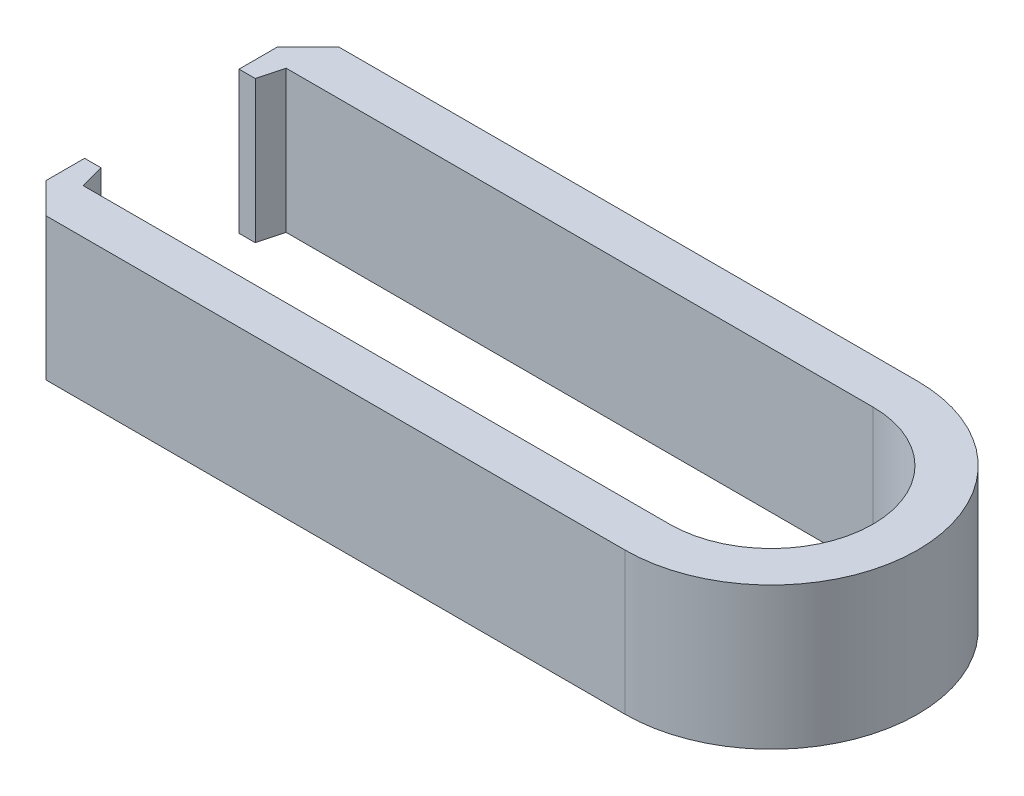
ISO-10303-21;
HEADER;
FILE_DESCRIPTION(('STEP AP214'),'2;1');
FILE_NAME('part.step','',(''),(''),'','','');
FILE_SCHEMA(('AUTOMOTIVE_DESIGN { 1 0 10303 214 1 1 1 1 }'));
ENDSEC;
DATA;
#1=APPLICATION_CONTEXT('core data for automotive mechanical design processes');
#2=APPLICATION_PROTOCOL_DEFINITION('international standard','automotive_design',2000,#1);
#3=PRODUCT_CONTEXT('',#1,'mechanical');
#4=PRODUCT('Part','Part','',(#3));
#5=PRODUCT_RELATED_PRODUCT_CATEGORY('part','',(#4));
#6=PRODUCT_DEFINITION_FORMATION('','',#4);
#7=PRODUCT_DEFINITION_CONTEXT('part definition',#1,'design');
#8=PRODUCT_DEFINITION('design','',#6,#7);
#9=PRODUCT_DEFINITION_SHAPE('','',#8);
#10=(LENGTH_UNIT() NAMED_UNIT(*) SI_UNIT(.MILLI.,.METRE.));
#11=(NAMED_UNIT(*) PLANE_ANGLE_UNIT() SI_UNIT($,.RADIAN.));
#12=(NAMED_UNIT(*) SI_UNIT($,.STERADIAN.) SOLID_ANGLE_UNIT());
#13=UNCERTAINTY_MEASURE_WITH_UNIT(LENGTH_MEASURE(1.E-05),#10,'distance_accuracy_value','');
#14=(GEOMETRIC_REPRESENTATION_CONTEXT(3) GLOBAL_UNCERTAINTY_ASSIGNED_CONTEXT((#13)) GLOBAL_UNIT_ASSIGNED_CONTEXT((#10,
#11,#12)) REPRESENTATION_CONTEXT('',''));
#15=CARTESIAN_POINT('',(0.,0.,0.));
#16=DIRECTION('',(0.,0.,1.));
#17=DIRECTION('',(1.,0.,0.));
#18=AXIS2_PLACEMENT_3D('',#15,#16,#17);
#19=CARTESIAN_POINT('',(-30.,7.,0.));
#20=DIRECTION('',(-1.,0.,0.));
#21=DIRECTION('',(0.,0.,1.));
#22=AXIS2_PLACEMENT_3D('',#19,#20,#21);
#23=PLANE('',#22);
#24=DIRECTION('',(0.,0.,-1.));
#25=VECTOR('',#24,1.);
#26=CARTESIAN_POINT('',(-30.,0.,0.));
#27=LINE('',#26,#25);
#28=CARTESIAN_POINT('',(-30.,0.,5.69999999999999));
#29=VERTEX_POINT('',#28);
#30=CARTESIAN_POINT('',(-30.,0.,3.8));
#31=VERTEX_POINT('',#30);
#32=EDGE_CURVE('E191',#29,#31,#27,.T.);
#33=ORIENTED_EDGE('',*,*,#32,.F.);
#34=DIRECTION('',(0.,1.,0.));
#35=VECTOR('',#34,1.);
#36=CARTESIAN_POINT('',(-30.,7.,5.69999999999999));
#37=LINE('',#36,#35);
#38=CARTESIAN_POINT('',(-30.,7.,5.69999999999999));
#39=VERTEX_POINT('',#38);
#40=EDGE_CURVE('E244',#29,#39,#37,.T.);
#41=ORIENTED_EDGE('',*,*,#40,.T.);
#42=DIRECTION('',(0.,0.,-1.));
#43=VECTOR('',#42,1.);
#44=CARTESIAN_POINT('',(-30.,7.,0.));
#45=LINE('',#44,#43);
#46=CARTESIAN_POINT('',(-30.,7.,3.8));
#47=VERTEX_POINT('',#46);
#48=EDGE_CURVE('E150',#39,#47,#45,.T.);
#49=ORIENTED_EDGE('',*,*,#48,.T.);
#50=DIRECTION('',(0.,-1.,0.));
#51=VECTOR('',#50,1.);
#52=CARTESIAN_POINT('',(-30.,7.,3.8));
#53=LINE('',#52,#51);
#54=EDGE_CURVE('E190',#47,#31,#53,.T.);
#55=ORIENTED_EDGE('',*,*,#54,.T.);
#56=EDGE_LOOP('',(#33,#41,#49,#55));
#57=FACE_BOUND('',#56,.T.);
#58=ADVANCED_FACE('F37',(#57),#23,.T.);
#59=CARTESIAN_POINT('',(0.,7.,7.2));
#60=DIRECTION('',(0.,0.,-1.));
#61=DIRECTION('',(-1.,0.,0.));
#62=AXIS2_PLACEMENT_3D('',#59,#60,#61);
#63=PLANE('',#62);
#64=DIRECTION('',(1.,0.,0.));
#65=VECTOR('',#64,1.);
#66=CARTESIAN_POINT('',(0.,7.,7.2));
#67=LINE('',#66,#65);
#68=CARTESIAN_POINT('',(-28.5,7.,7.2));
#69=VERTEX_POINT('',#68);
#70=CARTESIAN_POINT('',(0.,7.,7.2));
#71=VERTEX_POINT('',#70);
#72=EDGE_CURVE('E138',#69,#71,#67,.T.);
#73=ORIENTED_EDGE('',*,*,#72,.F.);
#74=DIRECTION('',(0.,-1.,0.));
#75=VECTOR('',#74,1.);
#76=CARTESIAN_POINT('',(-28.5,0.,7.2));
#77=LINE('',#76,#75);
#78=CARTESIAN_POINT('',(-28.5,0.,7.2));
#79=VERTEX_POINT('',#78);
#80=EDGE_CURVE('E160',#69,#79,#77,.T.);
#81=ORIENTED_EDGE('',*,*,#80,.T.);
#82=DIRECTION('',(1.,0.,0.));
#83=VECTOR('',#82,1.);
#84=CARTESIAN_POINT('',(0.,0.,7.2));
#85=LINE('',#84,#83);
#86=CARTESIAN_POINT('',(0.,0.,7.2));
#87=VERTEX_POINT('',#86);
#88=EDGE_CURVE('E156',#79,#87,#85,.T.);
#89=ORIENTED_EDGE('',*,*,#88,.T.);
#90=DIRECTION('',(0.,-1.,0.));
#91=VECTOR('',#90,1.);
#92=CARTESIAN_POINT('',(0.,7.,7.2));
#93=LINE('',#92,#91);
#94=EDGE_CURVE('E153',#71,#87,#93,.T.);
#95=ORIENTED_EDGE('',*,*,#94,.F.);
#96=EDGE_LOOP('',(#73,#81,#89,#95));
#97=FACE_BOUND('',#96,.T.);
#98=ADVANCED_FACE('F154',(#97),#63,.F.);
#99=CARTESIAN_POINT('',(0.,7.,0.));
#100=DIRECTION('',(0.,-1.,0.));
#101=DIRECTION('',(0.,0.,-1.));
#102=AXIS2_PLACEMENT_3D('',#99,#100,#101);
#103=CYLINDRICAL_SURFACE('',#102,7.2);
#104=CARTESIAN_POINT('',(0.,0.,0.));
#105=DIRECTION('',(0.,1.,0.));
#106=DIRECTION('',(0.,0.,1.));
#107=AXIS2_PLACEMENT_3D('',#104,#105,#106);
#108=CIRCLE('',#107,7.2);
#109=CARTESIAN_POINT('',(0.,0.,-7.2));
#110=VERTEX_POINT('',#109);
#111=EDGE_CURVE('E194',#87,#110,#108,.T.);
#112=ORIENTED_EDGE('',*,*,#111,.T.);
#113=DIRECTION('',(0.,-1.,0.));
#114=VECTOR('',#113,1.);
#115=CARTESIAN_POINT('',(0.,7.,-7.2));
#116=LINE('',#115,#114);
#117=CARTESIAN_POINT('',(0.,7.,-7.2));
#118=VERTEX_POINT('',#117);
#119=EDGE_CURVE('E161',#118,#110,#116,.T.);
#120=ORIENTED_EDGE('',*,*,#119,.F.);
#121=CARTESIAN_POINT('',(0.,7.,0.));
#122=DIRECTION('',(0.,1.,0.));
#123=DIRECTION('',(0.,0.,1.));
#124=AXIS2_PLACEMENT_3D('',#121,#122,#123);
#125=CIRCLE('',#124,7.2);
#126=EDGE_CURVE('E143',#71,#118,#125,.T.);
#127=ORIENTED_EDGE('',*,*,#126,.F.);
#128=ORIENTED_EDGE('',*,*,#94,.T.);
#129=EDGE_LOOP('',(#112,#120,#127,#128));
#130=FACE_BOUND('',#129,.T.);
#131=ADVANCED_FACE('F163',(#130),#103,.T.);
#132=CARTESIAN_POINT('',(0.,7.,-7.2));
#133=DIRECTION('',(0.,0.,-1.));
#134=DIRECTION('',(-1.,0.,0.));
#135=AXIS2_PLACEMENT_3D('',#132,#133,#134);
#136=PLANE('',#135);
#137=DIRECTION('',(1.,0.,0.));
#138=VECTOR('',#137,1.);
#139=CARTESIAN_POINT('',(0.,0.,-7.2));
#140=LINE('',#139,#138);
#141=CARTESIAN_POINT('',(-28.5,0.,-7.2));
#142=VERTEX_POINT('',#141);
#143=EDGE_CURVE('E196',#142,#110,#140,.T.);
#144=ORIENTED_EDGE('',*,*,#143,.F.);
#145=DIRECTION('',(0.,1.,0.));
#146=VECTOR('',#145,1.);
#147=CARTESIAN_POINT('',(-28.5,7.,-7.2));
#148=LINE('',#147,#146);
#149=CARTESIAN_POINT('',(-28.5,7.,-7.2));
#150=VERTEX_POINT('',#149);
#151=EDGE_CURVE('E11',#142,#150,#148,.T.);
#152=ORIENTED_EDGE('',*,*,#151,.T.);
#153=DIRECTION('',(1.,0.,0.));
#154=VECTOR('',#153,1.);
#155=CARTESIAN_POINT('',(0.,7.,-7.2));
#156=LINE('',#155,#154);
#157=EDGE_CURVE('E165',#150,#118,#156,.T.);
#158=ORIENTED_EDGE('',*,*,#157,.T.);
#159=ORIENTED_EDGE('',*,*,#119,.T.);
#160=EDGE_LOOP('',(#144,#152,#158,#159));
#161=FACE_BOUND('',#160,.T.);
#162=ADVANCED_FACE('F290',(#161),#136,.T.);
#163=CARTESIAN_POINT('',(-30.,7.,0.));
#164=DIRECTION('',(-1.,0.,0.));
#165=DIRECTION('',(0.,0.,1.));
#166=AXIS2_PLACEMENT_3D('',#163,#164,#165);
#167=PLANE('',#166);
#168=DIRECTION('',(0.,0.,-1.));
#169=VECTOR('',#168,1.);
#170=CARTESIAN_POINT('',(-30.,7.,0.));
#171=LINE('',#170,#169);
#172=CARTESIAN_POINT('',(-30.,7.,-3.8));
#173=VERTEX_POINT('',#172);
#174=CARTESIAN_POINT('',(-30.,7.,-5.7));
#175=VERTEX_POINT('',#174);
#176=EDGE_CURVE('E167',#173,#175,#171,.T.);
#177=ORIENTED_EDGE('',*,*,#176,.T.);
#178=DIRECTION('',(0.,-1.,0.));
#179=VECTOR('',#178,1.);
#180=CARTESIAN_POINT('',(-30.,7.,-5.7));
#181=LINE('',#180,#179);
#182=CARTESIAN_POINT('',(-30.,0.,-5.7));
#183=VERTEX_POINT('',#182);
#184=EDGE_CURVE('E46',#175,#183,#181,.T.);
#185=ORIENTED_EDGE('',*,*,#184,.T.);
#186=DIRECTION('',(0.,0.,-1.));
#187=VECTOR('',#186,1.);
#188=CARTESIAN_POINT('',(-30.,0.,0.));
#189=LINE('',#188,#187);
#190=CARTESIAN_POINT('',(-30.,0.,-3.8));
#191=VERTEX_POINT('',#190);
#192=EDGE_CURVE('E198',#191,#183,#189,.T.);
#193=ORIENTED_EDGE('',*,*,#192,.F.);
#194=DIRECTION('',(0.,-1.,0.));
#195=VECTOR('',#194,1.);
#196=CARTESIAN_POINT('',(-30.,7.,-3.8));
#197=LINE('',#196,#195);
#198=EDGE_CURVE('E236',#173,#191,#197,.T.);
#199=ORIENTED_EDGE('',*,*,#198,.F.);
#200=EDGE_LOOP('',(#177,#185,#193,#199));
#201=FACE_BOUND('',#200,.T.);
#202=ADVANCED_FACE('F251',(#201),#167,.T.);
#203=CARTESIAN_POINT('',(0.,7.,-3.8));
#204=DIRECTION('',(0.,0.,-1.));
#205=DIRECTION('',(-1.,0.,0.));
#206=AXIS2_PLACEMENT_3D('',#203,#204,#205);
#207=PLANE('',#206);
#208=DIRECTION('',(1.,0.,0.));
#209=VECTOR('',#208,1.);
#210=CARTESIAN_POINT('',(0.,0.,-3.8));
#211=LINE('',#210,#209);
#212=CARTESIAN_POINT('',(-29.2,0.,-3.8));
#213=VERTEX_POINT('',#212);
#214=EDGE_CURVE('E201',#191,#213,#211,.T.);
#215=ORIENTED_EDGE('',*,*,#214,.T.);
#216=DIRECTION('',(0.,-1.,0.));
#217=VECTOR('',#216,1.);
#218=CARTESIAN_POINT('',(-29.2,7.,-3.8));
#219=LINE('',#218,#217);
#220=CARTESIAN_POINT('',(-29.2,7.,-3.8));
#221=VERTEX_POINT('',#220);
#222=EDGE_CURVE('E233',#221,#213,#219,.T.);
#223=ORIENTED_EDGE('',*,*,#222,.F.);
#224=DIRECTION('',(1.,0.,0.));
#225=VECTOR('',#224,1.);
#226=CARTESIAN_POINT('',(0.,7.,-3.8));
#227=LINE('',#226,#225);
#228=EDGE_CURVE('E172',#173,#221,#227,.T.);
#229=ORIENTED_EDGE('',*,*,#228,.F.);
#230=ORIENTED_EDGE('',*,*,#198,.T.);
#231=EDGE_LOOP('',(#215,#223,#229,#230));
#232=FACE_BOUND('',#231,.T.);
#233=ADVANCED_FACE('F259',(#232),#207,.F.);
#234=CARTESIAN_POINT('',(-28.1939708952528,7.,-7.5545517328095));
#235=DIRECTION('',(-0.965925826289069,0.,-0.258819045102519));
#236=DIRECTION('',(-0.258819045102519,0.,0.965925826289069));
#237=AXIS2_PLACEMENT_3D('',#234,#235,#236);
#238=PLANE('',#237);
#239=DIRECTION('',(0.258819045102519,0.,-0.965925826289069));
#240=VECTOR('',#239,1.);
#241=CARTESIAN_POINT('',(-28.1939708952528,0.,-7.5545517328095));
#242=LINE('',#241,#240);
#243=CARTESIAN_POINT('',(-28.8784609690827,0.,-5.));
#244=VERTEX_POINT('',#243);
#245=EDGE_CURVE('E203',#213,#244,#242,.T.);
#246=ORIENTED_EDGE('',*,*,#245,.T.);
#247=DIRECTION('',(0.,-1.,0.));
#248=VECTOR('',#247,1.);
#249=CARTESIAN_POINT('',(-28.8784609690827,7.,-5.));
#250=LINE('',#249,#248);
#251=CARTESIAN_POINT('',(-28.8784609690827,7.,-5.));
#252=VERTEX_POINT('',#251);
#253=EDGE_CURVE('E231',#252,#244,#250,.T.);
#254=ORIENTED_EDGE('',*,*,#253,.F.);
#255=DIRECTION('',(0.258819045102519,0.,-0.965925826289069));
#256=VECTOR('',#255,1.);
#257=CARTESIAN_POINT('',(-28.1939708952528,7.,-7.5545517328095));
#258=LINE('',#257,#256);
#259=EDGE_CURVE('E174',#221,#252,#258,.T.);
#260=ORIENTED_EDGE('',*,*,#259,.F.);
#261=ORIENTED_EDGE('',*,*,#222,.T.);
#262=EDGE_LOOP('',(#246,#254,#260,#261));
#263=FACE_BOUND('',#262,.T.);
#264=ADVANCED_FACE('F263',(#263),#238,.F.);
#265=CARTESIAN_POINT('',(0.,7.,-5.));
#266=DIRECTION('',(0.,0.,1.));
#267=DIRECTION('',(1.,0.,0.));
#268=AXIS2_PLACEMENT_3D('',#265,#266,#267);
#269=PLANE('',#268);
#270=DIRECTION('',(-1.,0.,0.));
#271=VECTOR('',#270,1.);
#272=CARTESIAN_POINT('',(0.,0.,-5.));
#273=LINE('',#272,#271);
#274=CARTESIAN_POINT('',(0.,0.,-5.));
#275=VERTEX_POINT('',#274);
#276=EDGE_CURVE('E206',#275,#244,#273,.T.);
#277=ORIENTED_EDGE('',*,*,#276,.F.);
#278=DIRECTION('',(0.,-1.,0.));
#279=VECTOR('',#278,1.);
#280=CARTESIAN_POINT('',(0.,7.,-5.));
#281=LINE('',#280,#279);
#282=CARTESIAN_POINT('',(0.,7.,-5.));
#283=VERTEX_POINT('',#282);
#284=EDGE_CURVE('E229',#283,#275,#281,.T.);
#285=ORIENTED_EDGE('',*,*,#284,.F.);
#286=DIRECTION('',(-1.,0.,0.));
#287=VECTOR('',#286,1.);
#288=CARTESIAN_POINT('',(0.,7.,-5.));
#289=LINE('',#288,#287);
#290=EDGE_CURVE('E176',#283,#252,#289,.T.);
#291=ORIENTED_EDGE('',*,*,#290,.T.);
#292=ORIENTED_EDGE('',*,*,#253,.T.);
#293=EDGE_LOOP('',(#277,#285,#291,#292));
#294=FACE_BOUND('',#293,.T.);
#295=ADVANCED_FACE('F317',(#294),#269,.T.);
#296=CARTESIAN_POINT('',(0.,7.,0.));
#297=DIRECTION('',(0.,-1.,0.));
#298=DIRECTION('',(0.,0.,-1.));
#299=AXIS2_PLACEMENT_3D('',#296,#297,#298);
#300=CYLINDRICAL_SURFACE('',#299,5.);
#301=CARTESIAN_POINT('',(0.,0.,0.));
#302=DIRECTION('',(0.,1.,0.));
#303=DIRECTION('',(0.,0.,1.));
#304=AXIS2_PLACEMENT_3D('',#301,#302,#303);
#305=CIRCLE('',#304,5.);
#306=CARTESIAN_POINT('',(0.,0.,5.));
#307=VERTEX_POINT('',#306);
#308=EDGE_CURVE('E209',#307,#275,#305,.T.);
#309=ORIENTED_EDGE('',*,*,#308,.F.);
#310=DIRECTION('',(0.,-1.,0.));
#311=VECTOR('',#310,1.);
#312=CARTESIAN_POINT('',(0.,7.,5.));
#313=LINE('',#312,#311);
#314=CARTESIAN_POINT('',(0.,7.,5.));
#315=VERTEX_POINT('',#314);
#316=EDGE_CURVE('E227',#315,#307,#313,.T.);
#317=ORIENTED_EDGE('',*,*,#316,.F.);
#318=CARTESIAN_POINT('',(0.,7.,0.));
#319=DIRECTION('',(0.,1.,0.));
#320=DIRECTION('',(0.,0.,1.));
#321=AXIS2_PLACEMENT_3D('',#318,#319,#320);
#322=CIRCLE('',#321,5.);
#323=EDGE_CURVE('E179',#315,#283,#322,.T.);
#324=ORIENTED_EDGE('',*,*,#323,.T.);
#325=ORIENTED_EDGE('',*,*,#284,.T.);
#326=EDGE_LOOP('',(#309,#317,#324,#325));
#327=FACE_BOUND('',#326,.T.);
#328=ADVANCED_FACE('F270',(#327),#300,.F.);
#329=CARTESIAN_POINT('',(0.,7.,5.));
#330=DIRECTION('',(0.,0.,1.));
#331=DIRECTION('',(1.,0.,0.));
#332=AXIS2_PLACEMENT_3D('',#329,#330,#331);
#333=PLANE('',#332);
#334=DIRECTION('',(-1.,0.,0.));
#335=VECTOR('',#334,1.);
#336=CARTESIAN_POINT('',(0.,0.,5.));
#337=LINE('',#336,#335);
#338=CARTESIAN_POINT('',(-28.8784609690827,0.,5.));
#339=VERTEX_POINT('',#338);
#340=EDGE_CURVE('E212',#307,#339,#337,.T.);
#341=ORIENTED_EDGE('',*,*,#340,.T.);
#342=DIRECTION('',(0.,-1.,0.));
#343=VECTOR('',#342,1.);
#344=CARTESIAN_POINT('',(-28.8784609690827,7.,5.));
#345=LINE('',#344,#343);
#346=CARTESIAN_POINT('',(-28.8784609690827,7.,5.));
#347=VERTEX_POINT('',#346);
#348=EDGE_CURVE('E225',#347,#339,#345,.T.);
#349=ORIENTED_EDGE('',*,*,#348,.F.);
#350=DIRECTION('',(-1.,0.,0.));
#351=VECTOR('',#350,1.);
#352=CARTESIAN_POINT('',(0.,7.,5.));
#353=LINE('',#352,#351);
#354=EDGE_CURVE('E182',#315,#347,#353,.T.);
#355=ORIENTED_EDGE('',*,*,#354,.F.);
#356=ORIENTED_EDGE('',*,*,#316,.T.);
#357=EDGE_LOOP('',(#341,#349,#355,#356));
#358=FACE_BOUND('',#357,.T.);
#359=ADVANCED_FACE('F276',(#358),#333,.F.);
#360=CARTESIAN_POINT('',(-28.1939708952528,7.,7.5545517328095));
#361=DIRECTION('',(0.965925826289069,0.,-0.258819045102519));
#362=DIRECTION('',(-0.258819045102519,0.,-0.965925826289069));
#363=AXIS2_PLACEMENT_3D('',#360,#361,#362);
#364=PLANE('',#363);
#365=DIRECTION('',(0.258819045102519,0.,0.965925826289069));
#366=VECTOR('',#365,1.);
#367=CARTESIAN_POINT('',(-28.1939708952528,0.,7.5545517328095));
#368=LINE('',#367,#366);
#369=CARTESIAN_POINT('',(-29.2,0.,3.8));
#370=VERTEX_POINT('',#369);
#371=EDGE_CURVE('E215',#370,#339,#368,.T.);
#372=ORIENTED_EDGE('',*,*,#371,.F.);
#373=DIRECTION('',(0.,-1.,0.));
#374=VECTOR('',#373,1.);
#375=CARTESIAN_POINT('',(-29.2,7.,3.8));
#376=LINE('',#375,#374);
#377=CARTESIAN_POINT('',(-29.2,7.,3.8));
#378=VERTEX_POINT('',#377);
#379=EDGE_CURVE('E223',#378,#370,#376,.T.);
#380=ORIENTED_EDGE('',*,*,#379,.F.);
#381=DIRECTION('',(0.258819045102519,0.,0.965925826289069));
#382=VECTOR('',#381,1.);
#383=CARTESIAN_POINT('',(-28.1939708952528,7.,7.5545517328095));
#384=LINE('',#383,#382);
#385=EDGE_CURVE('E184',#378,#347,#384,.T.);
#386=ORIENTED_EDGE('',*,*,#385,.T.);
#387=ORIENTED_EDGE('',*,*,#348,.T.);
#388=EDGE_LOOP('',(#372,#380,#386,#387));
#389=FACE_BOUND('',#388,.T.);
#390=ADVANCED_FACE('F324',(#389),#364,.T.);
#391=CARTESIAN_POINT('',(0.,7.,3.8));
#392=DIRECTION('',(0.,0.,-1.));
#393=DIRECTION('',(-1.,0.,0.));
#394=AXIS2_PLACEMENT_3D('',#391,#392,#393);
#395=PLANE('',#394);
#396=DIRECTION('',(1.,0.,0.));
#397=VECTOR('',#396,1.);
#398=CARTESIAN_POINT('',(0.,0.,3.8));
#399=LINE('',#398,#397);
#400=EDGE_CURVE('E218',#31,#370,#399,.T.);
#401=ORIENTED_EDGE('',*,*,#400,.F.);
#402=ORIENTED_EDGE('',*,*,#54,.F.);
#403=DIRECTION('',(1.,0.,0.));
#404=VECTOR('',#403,1.);
#405=CARTESIAN_POINT('',(0.,7.,3.8));
#406=LINE('',#405,#404);
#407=EDGE_CURVE('E187',#47,#378,#406,.T.);
#408=ORIENTED_EDGE('',*,*,#407,.T.);
#409=ORIENTED_EDGE('',*,*,#379,.T.);
#410=EDGE_LOOP('',(#401,#402,#408,#409));
#411=FACE_BOUND('',#410,.T.);
#412=ADVANCED_FACE('F283',(#411),#395,.T.);
#413=CARTESIAN_POINT('',(0.,7.,0.));
#414=DIRECTION('',(0.,1.,0.));
#415=DIRECTION('',(0.,0.,1.));
#416=AXIS2_PLACEMENT_3D('',#413,#414,#415);
#417=PLANE('',#416);
#418=ORIENTED_EDGE('',*,*,#48,.F.);
#419=DIRECTION('',(0.707106781186545,0.,0.70710678118655));
#420=VECTOR('',#419,1.);
#421=CARTESIAN_POINT('',(-17.8500000000001,7.,17.85));
#422=LINE('',#421,#420);
#423=EDGE_CURVE('E146',#39,#69,#422,.T.);
#424=ORIENTED_EDGE('',*,*,#423,.T.);
#425=ORIENTED_EDGE('',*,*,#72,.T.);
#426=ORIENTED_EDGE('',*,*,#126,.T.);
#427=ORIENTED_EDGE('',*,*,#157,.F.);
#428=DIRECTION('',(0.707106781186549,0.,-0.707106781186546));
#429=VECTOR('',#428,1.);
#430=CARTESIAN_POINT('',(-17.8499999999999,7.,-17.85));
#431=LINE('',#430,#429);
#432=EDGE_CURVE('E53',#150,#175,#431,.F.);
#433=ORIENTED_EDGE('',*,*,#432,.T.);
#434=ORIENTED_EDGE('',*,*,#176,.F.);
#435=ORIENTED_EDGE('',*,*,#228,.T.);
#436=ORIENTED_EDGE('',*,*,#259,.T.);
#437=ORIENTED_EDGE('',*,*,#290,.F.);
#438=ORIENTED_EDGE('',*,*,#323,.F.);
#439=ORIENTED_EDGE('',*,*,#354,.T.);
#440=ORIENTED_EDGE('',*,*,#385,.F.);
#441=ORIENTED_EDGE('',*,*,#407,.F.);
#442=EDGE_LOOP('',(#418,#424,#425,#426,#427,#433,#434,#435,#436,#437,#438,#439,#440,#441));
#443=FACE_BOUND('',#442,.T.);
#444=ADVANCED_FACE('F141',(#443),#417,.T.);
#445=CARTESIAN_POINT('',(0.,0.,0.));
#446=DIRECTION('',(0.,1.,0.));
#447=DIRECTION('',(0.,0.,1.));
#448=AXIS2_PLACEMENT_3D('',#445,#446,#447);
#449=PLANE('',#448);
#450=ORIENTED_EDGE('',*,*,#88,.F.);
#451=DIRECTION('',(-0.707106781186545,0.,-0.70710678118655));
#452=VECTOR('',#451,1.);
#453=CARTESIAN_POINT('',(-28.5,0.,7.2));
#454=LINE('',#453,#452);
#455=EDGE_CURVE('E242',#79,#29,#454,.T.);
#456=ORIENTED_EDGE('',*,*,#455,.T.);
#457=ORIENTED_EDGE('',*,*,#32,.T.);
#458=ORIENTED_EDGE('',*,*,#400,.T.);
#459=ORIENTED_EDGE('',*,*,#371,.T.);
#460=ORIENTED_EDGE('',*,*,#340,.F.);
#461=ORIENTED_EDGE('',*,*,#308,.T.);
#462=ORIENTED_EDGE('',*,*,#276,.T.);
#463=ORIENTED_EDGE('',*,*,#245,.F.);
#464=ORIENTED_EDGE('',*,*,#214,.F.);
#465=ORIENTED_EDGE('',*,*,#192,.T.);
#466=DIRECTION('',(-0.707106781186549,0.,0.707106781186546));
#467=VECTOR('',#466,1.);
#468=CARTESIAN_POINT('',(-30.,0.,-5.7));
#469=LINE('',#468,#467);
#470=EDGE_CURVE('E240',#183,#142,#469,.F.);
#471=ORIENTED_EDGE('',*,*,#470,.T.);
#472=ORIENTED_EDGE('',*,*,#143,.T.);
#473=ORIENTED_EDGE('',*,*,#111,.F.);
#474=EDGE_LOOP('',(#450,#456,#457,#458,#459,#460,#461,#462,#463,#464,#465,#471,#472,#473));
#475=FACE_BOUND('',#474,.T.);
#476=ADVANCED_FACE('F255',(#475),#449,.F.);
#477=CARTESIAN_POINT('',(-28.5,7.,7.2));
#478=DIRECTION('',(-0.70710678118655,0.,0.707106781186545));
#479=DIRECTION('',(0.,1.,0.));
#480=AXIS2_PLACEMENT_3D('',#477,#478,#479);
#481=PLANE('',#480);
#482=ORIENTED_EDGE('',*,*,#423,.F.);
#483=ORIENTED_EDGE('',*,*,#40,.F.);
#484=ORIENTED_EDGE('',*,*,#455,.F.);
#485=ORIENTED_EDGE('',*,*,#80,.F.);
#486=EDGE_LOOP('',(#482,#483,#484,#485));
#487=FACE_BOUND('',#486,.T.);
#488=ADVANCED_FACE('F289',(#487),#481,.T.);
#489=CARTESIAN_POINT('',(-30.,7.,-5.7));
#490=DIRECTION('',(0.707106781186546,0.,0.707106781186549));
#491=DIRECTION('',(0.,-1.,0.));
#492=AXIS2_PLACEMENT_3D('',#489,#490,#491);
#493=PLANE('',#492);
#494=ORIENTED_EDGE('',*,*,#432,.F.);
#495=ORIENTED_EDGE('',*,*,#151,.F.);
#496=ORIENTED_EDGE('',*,*,#470,.F.);
#497=ORIENTED_EDGE('',*,*,#184,.F.);
#498=EDGE_LOOP('',(#494,#495,#496,#497));
#499=FACE_BOUND('',#498,.T.);
#500=ADVANCED_FACE('F40',(#499),#493,.F.);
#501=CLOSED_SHELL('',(#58,#98,#131,#162,#202,#233,#264,#295,#328,#359,#390,#412,#444,#476,#488,#500));
#502=MANIFOLD_SOLID_BREP('B2',#501);
#503=ADVANCED_BREP_SHAPE_REPRESENTATION('',(#18,#502),#14);
#504=SHAPE_DEFINITION_REPRESENTATION(#9,#503);
ENDSEC;
END-ISO-10303-21;
